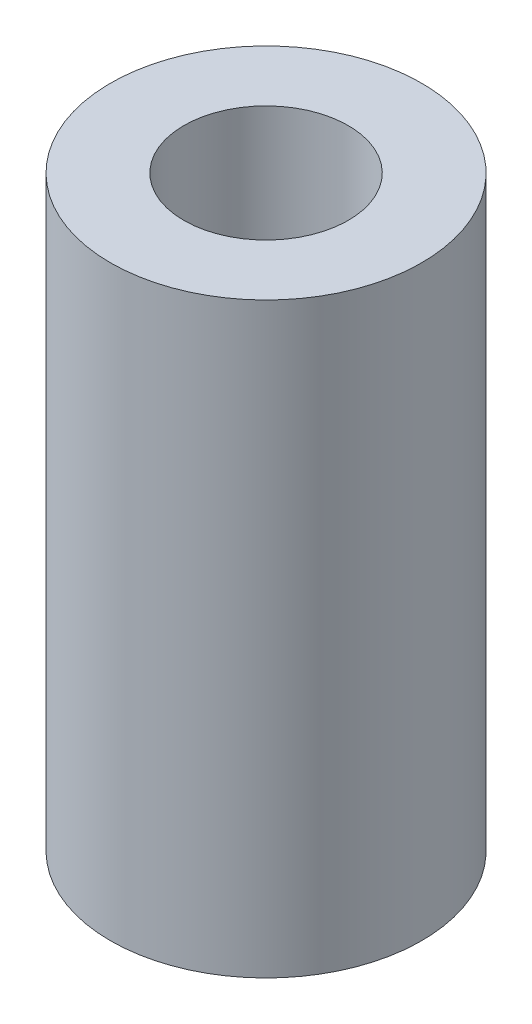
ISO-10303-21;
HEADER;
FILE_DESCRIPTION(('STEP AP214'),'2;1');
FILE_NAME('part.step','',(''),(''),'','','');
FILE_SCHEMA(('AUTOMOTIVE_DESIGN { 1 0 10303 214 1 1 1 1 }'));
ENDSEC;
DATA;
#1=APPLICATION_CONTEXT('core data for automotive mechanical design processes');
#2=APPLICATION_PROTOCOL_DEFINITION('international standard','automotive_design',2000,#1);
#3=PRODUCT_CONTEXT('',#1,'mechanical');
#4=PRODUCT('Part','Part','',(#3));
#5=PRODUCT_RELATED_PRODUCT_CATEGORY('part','',(#4));
#6=PRODUCT_DEFINITION_FORMATION('','',#4);
#7=PRODUCT_DEFINITION_CONTEXT('part definition',#1,'design');
#8=PRODUCT_DEFINITION('design','',#6,#7);
#9=PRODUCT_DEFINITION_SHAPE('','',#8);
#10=(LENGTH_UNIT() NAMED_UNIT(*) SI_UNIT(.MILLI.,.METRE.));
#11=(NAMED_UNIT(*) PLANE_ANGLE_UNIT() SI_UNIT($,.RADIAN.));
#12=(NAMED_UNIT(*) SI_UNIT($,.STERADIAN.) SOLID_ANGLE_UNIT());
#13=UNCERTAINTY_MEASURE_WITH_UNIT(LENGTH_MEASURE(1.E-05),#10,'distance_accuracy_value','');
#14=(GEOMETRIC_REPRESENTATION_CONTEXT(3) GLOBAL_UNCERTAINTY_ASSIGNED_CONTEXT((#13)) GLOBAL_UNIT_ASSIGNED_CONTEXT((#10,
#11,#12)) REPRESENTATION_CONTEXT('',''));
#15=CARTESIAN_POINT('',(0.,0.,0.));
#16=DIRECTION('',(0.,0.,1.));
#17=DIRECTION('',(1.,0.,0.));
#18=AXIS2_PLACEMENT_3D('',#15,#16,#17);
#19=CARTESIAN_POINT('',(0.,25.,0.));
#20=DIRECTION('',(0.,1.,0.));
#21=DIRECTION('',(0.,0.,1.));
#22=AXIS2_PLACEMENT_3D('',#19,#20,#21);
#23=PLANE('',#22);
#24=CARTESIAN_POINT('',(0.,25.,0.));
#25=DIRECTION('',(0.,1.,0.));
#26=DIRECTION('',(0.,0.,1.));
#27=AXIS2_PLACEMENT_3D('',#24,#25,#26);
#28=CIRCLE('',#27,13.25);
#29=CARTESIAN_POINT('',(0.,25.,13.25));
#30=VERTEX_POINT('',#29);
#31=EDGE_CURVE('E10',#30,#30,#28,.T.);
#32=ORIENTED_EDGE('',*,*,#31,.T.);
#33=EDGE_LOOP('',(#32));
#34=FACE_BOUND('',#33,.T.);
#35=CARTESIAN_POINT('',(0.,25.,0.));
#36=DIRECTION('',(0.,1.,0.));
#37=DIRECTION('',(0.,0.,1.));
#38=AXIS2_PLACEMENT_3D('',#35,#36,#37);
#39=CIRCLE('',#38,7.);
#40=CARTESIAN_POINT('',(0.,25.,7.));
#41=VERTEX_POINT('',#40);
#42=EDGE_CURVE('E46',#41,#41,#39,.T.);
#43=ORIENTED_EDGE('',*,*,#42,.F.);
#44=EDGE_LOOP('',(#43));
#45=FACE_BOUND('',#44,.T.);
#46=ADVANCED_FACE('F35',(#34,#45),#23,.T.);
#47=CARTESIAN_POINT('',(0.,-25.,0.));
#48=DIRECTION('',(0.,1.,0.));
#49=DIRECTION('',(0.,0.,1.));
#50=AXIS2_PLACEMENT_3D('',#47,#48,#49);
#51=PLANE('',#50);
#52=CARTESIAN_POINT('',(0.,-25.,0.));
#53=DIRECTION('',(0.,1.,0.));
#54=DIRECTION('',(0.,0.,1.));
#55=AXIS2_PLACEMENT_3D('',#52,#53,#54);
#56=CIRCLE('',#55,13.25);
#57=CARTESIAN_POINT('',(0.,-25.,13.25));
#58=VERTEX_POINT('',#57);
#59=EDGE_CURVE('E39',#58,#58,#56,.T.);
#60=ORIENTED_EDGE('',*,*,#59,.F.);
#61=EDGE_LOOP('',(#60));
#62=FACE_BOUND('',#61,.T.);
#63=CARTESIAN_POINT('',(0.,-25.,0.));
#64=DIRECTION('',(0.,1.,0.));
#65=DIRECTION('',(0.,0.,1.));
#66=AXIS2_PLACEMENT_3D('',#63,#64,#65);
#67=CIRCLE('',#66,7.);
#68=CARTESIAN_POINT('',(0.,-25.,7.));
#69=VERTEX_POINT('',#68);
#70=EDGE_CURVE('E48',#69,#69,#67,.T.);
#71=ORIENTED_EDGE('',*,*,#70,.T.);
#72=EDGE_LOOP('',(#71));
#73=FACE_BOUND('',#72,.T.);
#74=ADVANCED_FACE('F58',(#62,#73),#51,.F.);
#75=CARTESIAN_POINT('',(0.,25.,0.));
#76=DIRECTION('',(0.,-1.,0.));
#77=DIRECTION('',(0.,0.,-1.));
#78=AXIS2_PLACEMENT_3D('',#75,#76,#77);
#79=CYLINDRICAL_SURFACE('',#78,13.25);
#80=ORIENTED_EDGE('',*,*,#31,.F.);
#81=EDGE_LOOP('',(#80));
#82=FACE_BOUND('',#81,.T.);
#83=ORIENTED_EDGE('',*,*,#59,.T.);
#84=EDGE_LOOP('',(#83));
#85=FACE_BOUND('',#84,.T.);
#86=ADVANCED_FACE('F37',(#82,#85),#79,.T.);
#87=CARTESIAN_POINT('',(0.,25.,0.));
#88=DIRECTION('',(0.,-1.,0.));
#89=DIRECTION('',(0.,0.,-1.));
#90=AXIS2_PLACEMENT_3D('',#87,#88,#89);
#91=CYLINDRICAL_SURFACE('',#90,7.);
#92=ORIENTED_EDGE('',*,*,#42,.T.);
#93=EDGE_LOOP('',(#92));
#94=FACE_BOUND('',#93,.T.);
#95=ORIENTED_EDGE('',*,*,#70,.F.);
#96=EDGE_LOOP('',(#95));
#97=FACE_BOUND('',#96,.T.);
#98=ADVANCED_FACE('F54',(#94,#97),#91,.F.);
#99=CLOSED_SHELL('',(#46,#74,#86,#98));
#100=MANIFOLD_SOLID_BREP('B2',#99);
#101=ADVANCED_BREP_SHAPE_REPRESENTATION('',(#18,#100),#14);
#102=SHAPE_DEFINITION_REPRESENTATION(#9,#101);
ENDSEC;
END-ISO-10303-21;
